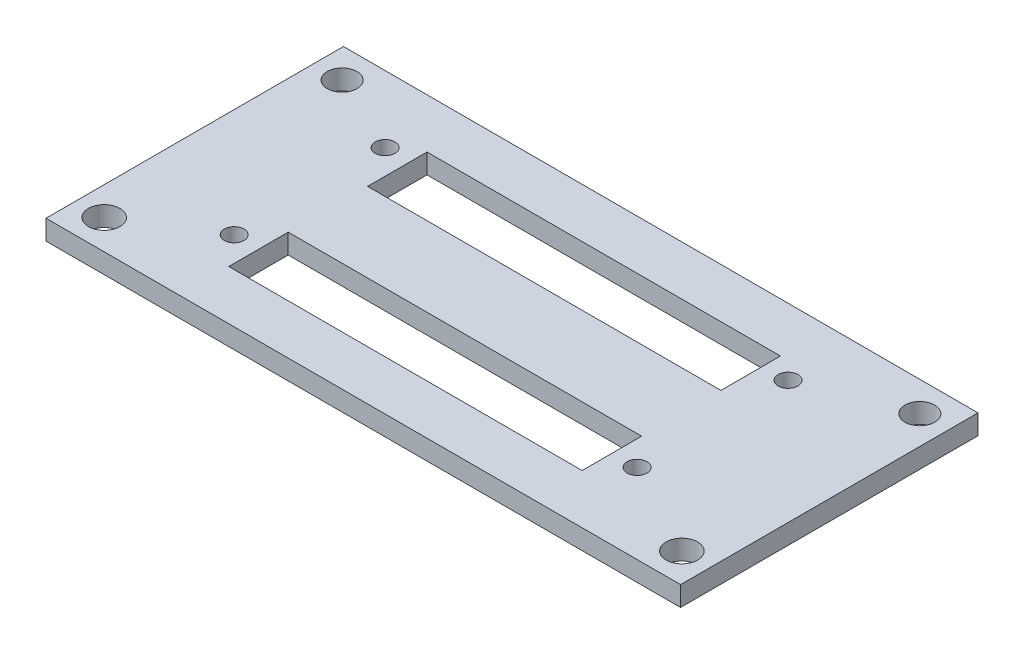
ISO-10303-21;
HEADER;
FILE_DESCRIPTION(('STEP AP214'),'2;1');
FILE_NAME('part.step','',(''),(''),'','','');
FILE_SCHEMA(('AUTOMOTIVE_DESIGN { 1 0 10303 214 1 1 1 1 }'));
ENDSEC;
DATA;
#1=APPLICATION_CONTEXT('core data for automotive mechanical design processes');
#2=APPLICATION_PROTOCOL_DEFINITION('international standard','automotive_design',2000,#1);
#3=PRODUCT_CONTEXT('',#1,'mechanical');
#4=PRODUCT('Part','Part','',(#3));
#5=PRODUCT_RELATED_PRODUCT_CATEGORY('part','',(#4));
#6=PRODUCT_DEFINITION_FORMATION('','',#4);
#7=PRODUCT_DEFINITION_CONTEXT('part definition',#1,'design');
#8=PRODUCT_DEFINITION('design','',#6,#7);
#9=PRODUCT_DEFINITION_SHAPE('','',#8);
#10=(LENGTH_UNIT() NAMED_UNIT(*) SI_UNIT(.MILLI.,.METRE.));
#11=(NAMED_UNIT(*) PLANE_ANGLE_UNIT() SI_UNIT($,.RADIAN.));
#12=(NAMED_UNIT(*) SI_UNIT($,.STERADIAN.) SOLID_ANGLE_UNIT());
#13=UNCERTAINTY_MEASURE_WITH_UNIT(LENGTH_MEASURE(1.E-05),#10,'distance_accuracy_value','');
#14=(GEOMETRIC_REPRESENTATION_CONTEXT(3) GLOBAL_UNCERTAINTY_ASSIGNED_CONTEXT((#13)) GLOBAL_UNIT_ASSIGNED_CONTEXT((#10,
#11,#12)) REPRESENTATION_CONTEXT('',''));
#15=CARTESIAN_POINT('',(0.,0.,0.));
#16=DIRECTION('',(0.,0.,1.));
#17=DIRECTION('',(1.,0.,0.));
#18=AXIS2_PLACEMENT_3D('',#15,#16,#17);
#19=CARTESIAN_POINT('',(0.,2.,0.));
#20=DIRECTION('',(0.,1.,0.));
#21=DIRECTION('',(0.,0.,1.));
#22=AXIS2_PLACEMENT_3D('',#19,#20,#21);
#23=PLANE('',#22);
#24=CARTESIAN_POINT('',(19.5714490056159,2.,-8.26717041311153));
#25=DIRECTION('',(0.,1.,0.));
#26=DIRECTION('',(0.,0.,-1.));
#27=AXIS2_PLACEMENT_3D('',#24,#25,#26);
#28=CIRCLE('',#27,1.);
#29=CARTESIAN_POINT('',(19.5714490056159,2.,-9.26717041311153));
#30=VERTEX_POINT('',#29);
#31=EDGE_CURVE('E185',#30,#30,#28,.T.);
#32=ORIENTED_EDGE('',*,*,#31,.F.);
#33=EDGE_LOOP('',(#32));
#34=FACE_BOUND('',#33,.T.);
#35=CARTESIAN_POINT('',(19.5714490056159,2.,6.95282958688847));
#36=DIRECTION('',(0.,1.,0.));
#37=DIRECTION('',(0.,0.,1.));
#38=AXIS2_PLACEMENT_3D('',#35,#36,#37);
#39=CIRCLE('',#38,1.);
#40=CARTESIAN_POINT('',(19.5714490056159,2.,7.95282958688847));
#41=VERTEX_POINT('',#40);
#42=EDGE_CURVE('E193',#41,#41,#39,.T.);
#43=ORIENTED_EDGE('',*,*,#42,.F.);
#44=EDGE_LOOP('',(#43));
#45=FACE_BOUND('',#44,.T.);
#46=CARTESIAN_POINT('',(-21.0685509943841,2.,6.95282958688847));
#47=DIRECTION('',(0.,1.,0.));
#48=DIRECTION('',(0.,0.,-1.));
#49=AXIS2_PLACEMENT_3D('',#46,#47,#48);
#50=CIRCLE('',#49,1.);
#51=CARTESIAN_POINT('',(-21.0685509943841,2.,5.95282958688847));
#52=VERTEX_POINT('',#51);
#53=EDGE_CURVE('E201',#52,#52,#50,.T.);
#54=ORIENTED_EDGE('',*,*,#53,.F.);
#55=EDGE_LOOP('',(#54));
#56=FACE_BOUND('',#55,.T.);
#57=DIRECTION('',(0.,0.,1.));
#58=VECTOR('',#57,1.);
#59=CARTESIAN_POINT('',(-18.5685509943841,2.,4.00000000000002));
#60=LINE('',#59,#58);
#61=CARTESIAN_POINT('',(-18.5685509943841,2.,4.00000000000002));
#62=VERTEX_POINT('',#61);
#63=CARTESIAN_POINT('',(-18.5685509943841,2.,10.));
#64=VERTEX_POINT('',#63);
#65=EDGE_CURVE('E55',#62,#64,#60,.T.);
#66=ORIENTED_EDGE('',*,*,#65,.F.);
#67=DIRECTION('',(-1.,0.,0.));
#68=VECTOR('',#67,1.);
#69=CARTESIAN_POINT('',(17.0718940548043,2.,4.));
#70=LINE('',#69,#68);
#71=CARTESIAN_POINT('',(17.0718940548043,2.,4.));
#72=VERTEX_POINT('',#71);
#73=EDGE_CURVE('E211',#72,#62,#70,.T.);
#74=ORIENTED_EDGE('',*,*,#73,.F.);
#75=DIRECTION('',(0.,0.,-1.));
#76=VECTOR('',#75,1.);
#77=CARTESIAN_POINT('',(17.0718940548043,2.,4.));
#78=LINE('',#77,#76);
#79=CARTESIAN_POINT('',(17.0718940548043,2.,10.));
#80=VERTEX_POINT('',#79);
#81=EDGE_CURVE('E230',#80,#72,#78,.T.);
#82=ORIENTED_EDGE('',*,*,#81,.F.);
#83=DIRECTION('',(1.,0.,0.));
#84=VECTOR('',#83,1.);
#85=CARTESIAN_POINT('',(17.0718940548043,2.,10.));
#86=LINE('',#85,#84);
#87=EDGE_CURVE('E226',#64,#80,#86,.T.);
#88=ORIENTED_EDGE('',*,*,#87,.F.);
#89=EDGE_LOOP('',(#66,#74,#82,#88));
#90=FACE_BOUND('',#89,.T.);
#91=DIRECTION('',(1.,0.,0.));
#92=VECTOR('',#91,1.);
#93=CARTESIAN_POINT('',(17.0718940548043,2.,-4.));
#94=LINE('',#93,#92);
#95=CARTESIAN_POINT('',(-18.5685509943841,2.,-4.00000000000001));
#96=VERTEX_POINT('',#95);
#97=CARTESIAN_POINT('',(17.0718940548043,2.,-4.));
#98=VERTEX_POINT('',#97);
#99=EDGE_CURVE('E63',#96,#98,#94,.T.);
#100=ORIENTED_EDGE('',*,*,#99,.F.);
#101=DIRECTION('',(0.,0.,1.));
#102=VECTOR('',#101,1.);
#103=CARTESIAN_POINT('',(-18.5685509943841,2.,-4.00000000000001));
#104=LINE('',#103,#102);
#105=CARTESIAN_POINT('',(-18.5685509943841,2.,-9.99999999999999));
#106=VERTEX_POINT('',#105);
#107=EDGE_CURVE('E153',#106,#96,#104,.T.);
#108=ORIENTED_EDGE('',*,*,#107,.F.);
#109=DIRECTION('',(-1.,0.,0.));
#110=VECTOR('',#109,1.);
#111=CARTESIAN_POINT('',(17.0718940548043,2.,-10.));
#112=LINE('',#111,#110);
#113=CARTESIAN_POINT('',(17.0718940548043,2.,-10.));
#114=VERTEX_POINT('',#113);
#115=EDGE_CURVE('E157',#114,#106,#112,.T.);
#116=ORIENTED_EDGE('',*,*,#115,.F.);
#117=DIRECTION('',(0.,0.,-1.));
#118=VECTOR('',#117,1.);
#119=CARTESIAN_POINT('',(17.0718940548043,2.,-4.));
#120=LINE('',#119,#118);
#121=EDGE_CURVE('E166',#98,#114,#120,.T.);
#122=ORIENTED_EDGE('',*,*,#121,.F.);
#123=EDGE_LOOP('',(#100,#108,#116,#122));
#124=FACE_BOUND('',#123,.T.);
#125=CARTESIAN_POINT('',(-21.0685509943841,2.,-8.26717041311153));
#126=DIRECTION('',(0.,1.,0.));
#127=DIRECTION('',(0.,0.,1.));
#128=AXIS2_PLACEMENT_3D('',#125,#126,#127);
#129=CIRCLE('',#128,1.);
#130=CARTESIAN_POINT('',(-21.0685509943841,2.,-7.26717041311153));
#131=VERTEX_POINT('',#130);
#132=EDGE_CURVE('E184',#131,#131,#129,.T.);
#133=ORIENTED_EDGE('',*,*,#132,.F.);
#134=EDGE_LOOP('',(#133));
#135=FACE_BOUND('',#134,.T.);
#136=CARTESIAN_POINT('',(29.13,2.,12.));
#137=DIRECTION('',(0.,1.,0.));
#138=DIRECTION('',(0.,0.,-1.));
#139=AXIS2_PLACEMENT_3D('',#136,#137,#138);
#140=CIRCLE('',#139,1.5893047834575);
#141=CARTESIAN_POINT('',(29.13,2.,10.4106952165425));
#142=VERTEX_POINT('',#141);
#143=EDGE_CURVE('E263',#142,#142,#140,.T.);
#144=ORIENTED_EDGE('',*,*,#143,.F.);
#145=EDGE_LOOP('',(#144));
#146=FACE_BOUND('',#145,.T.);
#147=CARTESIAN_POINT('',(-29.13,2.,12.));
#148=DIRECTION('',(0.,1.,0.));
#149=DIRECTION('',(0.,0.,1.));
#150=AXIS2_PLACEMENT_3D('',#147,#148,#149);
#151=CIRCLE('',#150,1.5893047834575);
#152=CARTESIAN_POINT('',(-29.13,2.,13.5893047834575));
#153=VERTEX_POINT('',#152);
#154=EDGE_CURVE('E279',#153,#153,#151,.T.);
#155=ORIENTED_EDGE('',*,*,#154,.F.);
#156=EDGE_LOOP('',(#155));
#157=FACE_BOUND('',#156,.T.);
#158=DIRECTION('',(0.,0.,1.));
#159=VECTOR('',#158,1.);
#160=CARTESIAN_POINT('',(-32.,2.,15.));
#161=LINE('',#160,#159);
#162=CARTESIAN_POINT('',(-32.,2.,-15.));
#163=VERTEX_POINT('',#162);
#164=CARTESIAN_POINT('',(-32.,2.,15.));
#165=VERTEX_POINT('',#164);
#166=EDGE_CURVE('E287',#163,#165,#161,.T.);
#167=ORIENTED_EDGE('',*,*,#166,.T.);
#168=DIRECTION('',(1.,0.,0.));
#169=VECTOR('',#168,1.);
#170=CARTESIAN_POINT('',(32.,2.,15.));
#171=LINE('',#170,#169);
#172=CARTESIAN_POINT('',(32.,2.,15.));
#173=VERTEX_POINT('',#172);
#174=EDGE_CURVE('E291',#165,#173,#171,.T.);
#175=ORIENTED_EDGE('',*,*,#174,.T.);
#176=DIRECTION('',(0.,0.,-1.));
#177=VECTOR('',#176,1.);
#178=CARTESIAN_POINT('',(32.,2.,15.));
#179=LINE('',#178,#177);
#180=CARTESIAN_POINT('',(32.,2.,-15.));
#181=VERTEX_POINT('',#180);
#182=EDGE_CURVE('E295',#173,#181,#179,.T.);
#183=ORIENTED_EDGE('',*,*,#182,.T.);
#184=DIRECTION('',(-1.,0.,0.));
#185=VECTOR('',#184,1.);
#186=CARTESIAN_POINT('',(32.,2.,-15.));
#187=LINE('',#186,#185);
#188=EDGE_CURVE('E298',#181,#163,#187,.T.);
#189=ORIENTED_EDGE('',*,*,#188,.T.);
#190=EDGE_LOOP('',(#167,#175,#183,#189));
#191=FACE_BOUND('',#190,.T.);
#192=CARTESIAN_POINT('',(-29.1341194094145,2.,-12.));
#193=DIRECTION('',(0.,1.,0.));
#194=DIRECTION('',(0.,0.,1.));
#195=AXIS2_PLACEMENT_3D('',#192,#193,#194);
#196=CIRCLE('',#195,1.5);
#197=CARTESIAN_POINT('',(-29.1341194094145,2.,-10.5));
#198=VERTEX_POINT('',#197);
#199=EDGE_CURVE('E271',#198,#198,#196,.T.);
#200=ORIENTED_EDGE('',*,*,#199,.F.);
#201=EDGE_LOOP('',(#200));
#202=FACE_BOUND('',#201,.T.);
#203=CARTESIAN_POINT('',(29.1341194094144,2.,-12.));
#204=DIRECTION('',(0.,1.,0.));
#205=DIRECTION('',(0.,0.,-1.));
#206=AXIS2_PLACEMENT_3D('',#203,#204,#205);
#207=CIRCLE('',#206,1.5);
#208=CARTESIAN_POINT('',(29.1341194094144,2.,-13.5));
#209=VERTEX_POINT('',#208);
#210=EDGE_CURVE('E255',#209,#209,#207,.T.);
#211=ORIENTED_EDGE('',*,*,#210,.F.);
#212=EDGE_LOOP('',(#211));
#213=FACE_BOUND('',#212,.T.);
#214=ADVANCED_FACE('F39',(#34,#45,#56,#90,#124,#135,#146,#157,#191,#202,#213),#23,.T.);
#215=CARTESIAN_POINT('',(0.,0.,0.));
#216=DIRECTION('',(0.,1.,0.));
#217=DIRECTION('',(0.,0.,1.));
#218=AXIS2_PLACEMENT_3D('',#215,#216,#217);
#219=PLANE('',#218);
#220=CARTESIAN_POINT('',(19.5714490056159,0.,-8.26717041311153));
#221=DIRECTION('',(0.,1.,0.));
#222=DIRECTION('',(0.,0.,-1.));
#223=AXIS2_PLACEMENT_3D('',#220,#221,#222);
#224=CIRCLE('',#223,1.);
#225=CARTESIAN_POINT('',(19.5714490056159,0.,-9.26717041311153));
#226=VERTEX_POINT('',#225);
#227=EDGE_CURVE('E180',#226,#226,#224,.T.);
#228=ORIENTED_EDGE('',*,*,#227,.T.);
#229=EDGE_LOOP('',(#228));
#230=FACE_BOUND('',#229,.T.);
#231=CARTESIAN_POINT('',(19.5714490056159,0.,6.95282958688847));
#232=DIRECTION('',(0.,1.,0.));
#233=DIRECTION('',(0.,0.,1.));
#234=AXIS2_PLACEMENT_3D('',#231,#232,#233);
#235=CIRCLE('',#234,1.);
#236=CARTESIAN_POINT('',(19.5714490056159,0.,7.95282958688847));
#237=VERTEX_POINT('',#236);
#238=EDGE_CURVE('E189',#237,#237,#235,.T.);
#239=ORIENTED_EDGE('',*,*,#238,.T.);
#240=EDGE_LOOP('',(#239));
#241=FACE_BOUND('',#240,.T.);
#242=CARTESIAN_POINT('',(-21.0685509943841,0.,6.95282958688847));
#243=DIRECTION('',(0.,1.,0.));
#244=DIRECTION('',(0.,0.,-1.));
#245=AXIS2_PLACEMENT_3D('',#242,#243,#244);
#246=CIRCLE('',#245,1.);
#247=CARTESIAN_POINT('',(-21.0685509943841,0.,5.95282958688847));
#248=VERTEX_POINT('',#247);
#249=EDGE_CURVE('E197',#248,#248,#246,.T.);
#250=ORIENTED_EDGE('',*,*,#249,.T.);
#251=EDGE_LOOP('',(#250));
#252=FACE_BOUND('',#251,.T.);
#253=DIRECTION('',(-1.,0.,0.));
#254=VECTOR('',#253,1.);
#255=CARTESIAN_POINT('',(17.0718940548043,0.,4.));
#256=LINE('',#255,#254);
#257=CARTESIAN_POINT('',(17.0718940548043,0.,4.));
#258=VERTEX_POINT('',#257);
#259=CARTESIAN_POINT('',(-18.5685509943841,0.,4.00000000000002));
#260=VERTEX_POINT('',#259);
#261=EDGE_CURVE('E219',#258,#260,#256,.T.);
#262=ORIENTED_EDGE('',*,*,#261,.T.);
#263=DIRECTION('',(0.,0.,1.));
#264=VECTOR('',#263,1.);
#265=CARTESIAN_POINT('',(-18.5685509943841,0.,4.00000000000002));
#266=LINE('',#265,#264);
#267=CARTESIAN_POINT('',(-18.5685509943841,0.,10.));
#268=VERTEX_POINT('',#267);
#269=EDGE_CURVE('E206',#260,#268,#266,.T.);
#270=ORIENTED_EDGE('',*,*,#269,.T.);
#271=DIRECTION('',(1.,0.,0.));
#272=VECTOR('',#271,1.);
#273=CARTESIAN_POINT('',(17.0718940548043,0.,10.));
#274=LINE('',#273,#272);
#275=CARTESIAN_POINT('',(17.0718940548043,0.,10.));
#276=VERTEX_POINT('',#275);
#277=EDGE_CURVE('E210',#268,#276,#274,.T.);
#278=ORIENTED_EDGE('',*,*,#277,.T.);
#279=DIRECTION('',(0.,0.,-1.));
#280=VECTOR('',#279,1.);
#281=CARTESIAN_POINT('',(17.0718940548043,0.,4.));
#282=LINE('',#281,#280);
#283=EDGE_CURVE('E215',#276,#258,#282,.T.);
#284=ORIENTED_EDGE('',*,*,#283,.T.);
#285=EDGE_LOOP('',(#262,#270,#278,#284));
#286=FACE_BOUND('',#285,.T.);
#287=DIRECTION('',(0.,0.,1.));
#288=VECTOR('',#287,1.);
#289=CARTESIAN_POINT('',(-18.5685509943841,0.,-4.00000000000001));
#290=LINE('',#289,#288);
#291=CARTESIAN_POINT('',(-18.5685509943841,0.,-9.99999999999999));
#292=VERTEX_POINT('',#291);
#293=CARTESIAN_POINT('',(-18.5685509943841,0.,-4.00000000000001));
#294=VERTEX_POINT('',#293);
#295=EDGE_CURVE('E138',#292,#294,#290,.T.);
#296=ORIENTED_EDGE('',*,*,#295,.T.);
#297=DIRECTION('',(1.,0.,0.));
#298=VECTOR('',#297,1.);
#299=CARTESIAN_POINT('',(17.0718940548043,0.,-4.));
#300=LINE('',#299,#298);
#301=CARTESIAN_POINT('',(17.0718940548043,0.,-4.));
#302=VERTEX_POINT('',#301);
#303=EDGE_CURVE('E131',#294,#302,#300,.T.);
#304=ORIENTED_EDGE('',*,*,#303,.T.);
#305=DIRECTION('',(0.,0.,-1.));
#306=VECTOR('',#305,1.);
#307=CARTESIAN_POINT('',(17.0718940548043,0.,-4.));
#308=LINE('',#307,#306);
#309=CARTESIAN_POINT('',(17.0718940548043,0.,-10.));
#310=VERTEX_POINT('',#309);
#311=EDGE_CURVE('E142',#302,#310,#308,.T.);
#312=ORIENTED_EDGE('',*,*,#311,.T.);
#313=DIRECTION('',(-1.,0.,0.));
#314=VECTOR('',#313,1.);
#315=CARTESIAN_POINT('',(17.0718940548043,0.,-10.));
#316=LINE('',#315,#314);
#317=EDGE_CURVE('E147',#310,#292,#316,.T.);
#318=ORIENTED_EDGE('',*,*,#317,.T.);
#319=EDGE_LOOP('',(#296,#304,#312,#318));
#320=FACE_BOUND('',#319,.T.);
#321=CARTESIAN_POINT('',(-21.0685509943841,0.,-8.26717041311153));
#322=DIRECTION('',(0.,1.,0.));
#323=DIRECTION('',(0.,0.,1.));
#324=AXIS2_PLACEMENT_3D('',#321,#322,#323);
#325=CIRCLE('',#324,1.);
#326=CARTESIAN_POINT('',(-21.0685509943841,0.,-7.26717041311153));
#327=VERTEX_POINT('',#326);
#328=EDGE_CURVE('E247',#327,#327,#325,.T.);
#329=ORIENTED_EDGE('',*,*,#328,.T.);
#330=EDGE_LOOP('',(#329));
#331=FACE_BOUND('',#330,.T.);
#332=DIRECTION('',(0.,0.,1.));
#333=VECTOR('',#332,1.);
#334=CARTESIAN_POINT('',(-32.,0.,15.));
#335=LINE('',#334,#333);
#336=CARTESIAN_POINT('',(-32.,0.,-15.));
#337=VERTEX_POINT('',#336);
#338=CARTESIAN_POINT('',(-32.,0.,15.));
#339=VERTEX_POINT('',#338);
#340=EDGE_CURVE('E283',#337,#339,#335,.T.);
#341=ORIENTED_EDGE('',*,*,#340,.F.);
#342=DIRECTION('',(-1.,0.,0.));
#343=VECTOR('',#342,1.);
#344=CARTESIAN_POINT('',(32.,0.,-15.));
#345=LINE('',#344,#343);
#346=CARTESIAN_POINT('',(32.,0.,-15.));
#347=VERTEX_POINT('',#346);
#348=EDGE_CURVE('E292',#347,#337,#345,.T.);
#349=ORIENTED_EDGE('',*,*,#348,.F.);
#350=DIRECTION('',(0.,0.,-1.));
#351=VECTOR('',#350,1.);
#352=CARTESIAN_POINT('',(32.,0.,15.));
#353=LINE('',#352,#351);
#354=CARTESIAN_POINT('',(32.,0.,15.));
#355=VERTEX_POINT('',#354);
#356=EDGE_CURVE('E308',#355,#347,#353,.T.);
#357=ORIENTED_EDGE('',*,*,#356,.F.);
#358=DIRECTION('',(1.,0.,0.));
#359=VECTOR('',#358,1.);
#360=CARTESIAN_POINT('',(32.,0.,15.));
#361=LINE('',#360,#359);
#362=EDGE_CURVE('E305',#339,#355,#361,.T.);
#363=ORIENTED_EDGE('',*,*,#362,.F.);
#364=EDGE_LOOP('',(#341,#349,#357,#363));
#365=FACE_BOUND('',#364,.T.);
#366=CARTESIAN_POINT('',(-29.13,0.,12.));
#367=DIRECTION('',(0.,1.,0.));
#368=DIRECTION('',(0.,0.,1.));
#369=AXIS2_PLACEMENT_3D('',#366,#367,#368);
#370=CIRCLE('',#369,1.5893047834575);
#371=CARTESIAN_POINT('',(-29.13,0.,13.5893047834575));
#372=VERTEX_POINT('',#371);
#373=EDGE_CURVE('E275',#372,#372,#370,.T.);
#374=ORIENTED_EDGE('',*,*,#373,.T.);
#375=EDGE_LOOP('',(#374));
#376=FACE_BOUND('',#375,.T.);
#377=CARTESIAN_POINT('',(-29.1341194094145,0.,-12.));
#378=DIRECTION('',(0.,1.,0.));
#379=DIRECTION('',(0.,0.,1.));
#380=AXIS2_PLACEMENT_3D('',#377,#378,#379);
#381=CIRCLE('',#380,1.5);
#382=CARTESIAN_POINT('',(-29.1341194094145,0.,-10.5));
#383=VERTEX_POINT('',#382);
#384=EDGE_CURVE('E267',#383,#383,#381,.T.);
#385=ORIENTED_EDGE('',*,*,#384,.T.);
#386=EDGE_LOOP('',(#385));
#387=FACE_BOUND('',#386,.T.);
#388=CARTESIAN_POINT('',(29.13,0.,12.));
#389=DIRECTION('',(0.,1.,0.));
#390=DIRECTION('',(0.,0.,-1.));
#391=AXIS2_PLACEMENT_3D('',#388,#389,#390);
#392=CIRCLE('',#391,1.5893047834575);
#393=CARTESIAN_POINT('',(29.13,0.,10.4106952165425));
#394=VERTEX_POINT('',#393);
#395=EDGE_CURVE('E259',#394,#394,#392,.T.);
#396=ORIENTED_EDGE('',*,*,#395,.T.);
#397=EDGE_LOOP('',(#396));
#398=FACE_BOUND('',#397,.T.);
#399=CARTESIAN_POINT('',(29.1341194094144,0.,-12.));
#400=DIRECTION('',(0.,1.,0.));
#401=DIRECTION('',(0.,0.,-1.));
#402=AXIS2_PLACEMENT_3D('',#399,#400,#401);
#403=CIRCLE('',#402,1.5);
#404=CARTESIAN_POINT('',(29.1341194094144,0.,-13.5));
#405=VERTEX_POINT('',#404);
#406=EDGE_CURVE('E251',#405,#405,#403,.T.);
#407=ORIENTED_EDGE('',*,*,#406,.T.);
#408=EDGE_LOOP('',(#407));
#409=FACE_BOUND('',#408,.T.);
#410=ADVANCED_FACE('F149',(#230,#241,#252,#286,#320,#331,#365,#376,#387,#398,#409),#219,.F.);
#411=CARTESIAN_POINT('',(-32.,2.,15.));
#412=DIRECTION('',(1.,0.,0.));
#413=DIRECTION('',(0.,0.,-1.));
#414=AXIS2_PLACEMENT_3D('',#411,#412,#413);
#415=PLANE('',#414);
#416=ORIENTED_EDGE('',*,*,#340,.T.);
#417=DIRECTION('',(0.,-1.,0.));
#418=VECTOR('',#417,1.);
#419=CARTESIAN_POINT('',(-32.,2.,15.));
#420=LINE('',#419,#418);
#421=EDGE_CURVE('E11',#165,#339,#420,.T.);
#422=ORIENTED_EDGE('',*,*,#421,.F.);
#423=ORIENTED_EDGE('',*,*,#166,.F.);
#424=DIRECTION('',(0.,-1.,0.));
#425=VECTOR('',#424,1.);
#426=CARTESIAN_POINT('',(-32.,2.,-15.));
#427=LINE('',#426,#425);
#428=EDGE_CURVE('E301',#163,#337,#427,.T.);
#429=ORIENTED_EDGE('',*,*,#428,.T.);
#430=EDGE_LOOP('',(#416,#422,#423,#429));
#431=FACE_BOUND('',#430,.T.);
#432=ADVANCED_FACE('F41',(#431),#415,.F.);
#433=CARTESIAN_POINT('',(32.,2.,15.));
#434=DIRECTION('',(0.,0.,-1.));
#435=DIRECTION('',(-1.,0.,0.));
#436=AXIS2_PLACEMENT_3D('',#433,#434,#435);
#437=PLANE('',#436);
#438=ORIENTED_EDGE('',*,*,#362,.T.);
#439=DIRECTION('',(0.,-1.,0.));
#440=VECTOR('',#439,1.);
#441=CARTESIAN_POINT('',(32.,2.,15.));
#442=LINE('',#441,#440);
#443=EDGE_CURVE('E48',#173,#355,#442,.T.);
#444=ORIENTED_EDGE('',*,*,#443,.F.);
#445=ORIENTED_EDGE('',*,*,#174,.F.);
#446=ORIENTED_EDGE('',*,*,#421,.T.);
#447=EDGE_LOOP('',(#438,#444,#445,#446));
#448=FACE_BOUND('',#447,.T.);
#449=ADVANCED_FACE('F341',(#448),#437,.F.);
#450=CARTESIAN_POINT('',(32.,2.,15.));
#451=DIRECTION('',(-1.,0.,0.));
#452=DIRECTION('',(0.,0.,1.));
#453=AXIS2_PLACEMENT_3D('',#450,#451,#452);
#454=PLANE('',#453);
#455=ORIENTED_EDGE('',*,*,#356,.T.);
#456=DIRECTION('',(0.,-1.,0.));
#457=VECTOR('',#456,1.);
#458=CARTESIAN_POINT('',(32.,2.,-15.));
#459=LINE('',#458,#457);
#460=EDGE_CURVE('E316',#181,#347,#459,.T.);
#461=ORIENTED_EDGE('',*,*,#460,.F.);
#462=ORIENTED_EDGE('',*,*,#182,.F.);
#463=ORIENTED_EDGE('',*,*,#443,.T.);
#464=EDGE_LOOP('',(#455,#461,#462,#463));
#465=FACE_BOUND('',#464,.T.);
#466=ADVANCED_FACE('F325',(#465),#454,.F.);
#467=CARTESIAN_POINT('',(32.,2.,-15.));
#468=DIRECTION('',(0.,0.,1.));
#469=DIRECTION('',(1.,0.,0.));
#470=AXIS2_PLACEMENT_3D('',#467,#468,#469);
#471=PLANE('',#470);
#472=ORIENTED_EDGE('',*,*,#348,.T.);
#473=ORIENTED_EDGE('',*,*,#428,.F.);
#474=ORIENTED_EDGE('',*,*,#188,.F.);
#475=ORIENTED_EDGE('',*,*,#460,.T.);
#476=EDGE_LOOP('',(#472,#473,#474,#475));
#477=FACE_BOUND('',#476,.T.);
#478=ADVANCED_FACE('F334',(#477),#471,.F.);
#479=CARTESIAN_POINT('',(-29.13,2.,12.));
#480=DIRECTION('',(0.,-1.,0.));
#481=DIRECTION('',(0.,0.,-1.));
#482=AXIS2_PLACEMENT_3D('',#479,#480,#481);
#483=CYLINDRICAL_SURFACE('',#482,1.5893047834575);
#484=ORIENTED_EDGE('',*,*,#154,.T.);
#485=EDGE_LOOP('',(#484));
#486=FACE_BOUND('',#485,.T.);
#487=ORIENTED_EDGE('',*,*,#373,.F.);
#488=EDGE_LOOP('',(#487));
#489=FACE_BOUND('',#488,.T.);
#490=ADVANCED_FACE('F359',(#486,#489),#483,.F.);
#491=CARTESIAN_POINT('',(-29.1341194094145,2.,-12.));
#492=DIRECTION('',(0.,-1.,0.));
#493=DIRECTION('',(0.,0.,-1.));
#494=AXIS2_PLACEMENT_3D('',#491,#492,#493);
#495=CYLINDRICAL_SURFACE('',#494,1.5);
#496=ORIENTED_EDGE('',*,*,#199,.T.);
#497=EDGE_LOOP('',(#496));
#498=FACE_BOUND('',#497,.T.);
#499=ORIENTED_EDGE('',*,*,#384,.F.);
#500=EDGE_LOOP('',(#499));
#501=FACE_BOUND('',#500,.T.);
#502=ADVANCED_FACE('F366',(#498,#501),#495,.F.);
#503=CARTESIAN_POINT('',(29.13,2.,12.));
#504=DIRECTION('',(0.,-1.,0.));
#505=DIRECTION('',(0.,0.,-1.));
#506=AXIS2_PLACEMENT_3D('',#503,#504,#505);
#507=CYLINDRICAL_SURFACE('',#506,1.5893047834575);
#508=ORIENTED_EDGE('',*,*,#143,.T.);
#509=EDGE_LOOP('',(#508));
#510=FACE_BOUND('',#509,.T.);
#511=ORIENTED_EDGE('',*,*,#395,.F.);
#512=EDGE_LOOP('',(#511));
#513=FACE_BOUND('',#512,.T.);
#514=ADVANCED_FACE('F371',(#510,#513),#507,.F.);
#515=CARTESIAN_POINT('',(29.1341194094144,2.,-12.));
#516=DIRECTION('',(0.,-1.,0.));
#517=DIRECTION('',(0.,0.,-1.));
#518=AXIS2_PLACEMENT_3D('',#515,#516,#517);
#519=CYLINDRICAL_SURFACE('',#518,1.5);
#520=ORIENTED_EDGE('',*,*,#210,.T.);
#521=EDGE_LOOP('',(#520));
#522=FACE_BOUND('',#521,.T.);
#523=ORIENTED_EDGE('',*,*,#406,.F.);
#524=EDGE_LOOP('',(#523));
#525=FACE_BOUND('',#524,.T.);
#526=ADVANCED_FACE('F383',(#522,#525),#519,.F.);
#527=CARTESIAN_POINT('',(-21.0685509943841,0.,-8.26717041311153));
#528=DIRECTION('',(0.,1.,0.));
#529=DIRECTION('',(0.,0.,1.));
#530=AXIS2_PLACEMENT_3D('',#527,#528,#529);
#531=CYLINDRICAL_SURFACE('',#530,1.);
#532=ORIENTED_EDGE('',*,*,#328,.F.);
#533=EDGE_LOOP('',(#532));
#534=FACE_BOUND('',#533,.T.);
#535=ORIENTED_EDGE('',*,*,#132,.T.);
#536=EDGE_LOOP('',(#535));
#537=FACE_BOUND('',#536,.T.);
#538=ADVANCED_FACE('F385',(#534,#537),#531,.F.);
#539=CARTESIAN_POINT('',(17.0718940548043,0.,-4.));
#540=DIRECTION('',(0.,0.,1.));
#541=DIRECTION('',(1.,0.,0.));
#542=AXIS2_PLACEMENT_3D('',#539,#540,#541);
#543=PLANE('',#542);
#544=ORIENTED_EDGE('',*,*,#99,.T.);
#545=DIRECTION('',(0.,1.,0.));
#546=VECTOR('',#545,1.);
#547=CARTESIAN_POINT('',(17.0718940548043,0.,-4.));
#548=LINE('',#547,#546);
#549=EDGE_CURVE('E127',#302,#98,#548,.T.);
#550=ORIENTED_EDGE('',*,*,#549,.F.);
#551=ORIENTED_EDGE('',*,*,#303,.F.);
#552=DIRECTION('',(0.,1.,0.));
#553=VECTOR('',#552,1.);
#554=CARTESIAN_POINT('',(-18.5685509943841,0.,-4.00000000000001));
#555=LINE('',#554,#553);
#556=EDGE_CURVE('E172',#294,#96,#555,.T.);
#557=ORIENTED_EDGE('',*,*,#556,.T.);
#558=EDGE_LOOP('',(#544,#550,#551,#557));
#559=FACE_BOUND('',#558,.T.);
#560=ADVANCED_FACE('F129',(#559),#543,.F.);
#561=CARTESIAN_POINT('',(-18.5685509943841,0.,-4.00000000000001));
#562=DIRECTION('',(-1.,0.,0.));
#563=DIRECTION('',(0.,0.,1.));
#564=AXIS2_PLACEMENT_3D('',#561,#562,#563);
#565=PLANE('',#564);
#566=ORIENTED_EDGE('',*,*,#107,.T.);
#567=ORIENTED_EDGE('',*,*,#556,.F.);
#568=ORIENTED_EDGE('',*,*,#295,.F.);
#569=DIRECTION('',(0.,1.,0.));
#570=VECTOR('',#569,1.);
#571=CARTESIAN_POINT('',(-18.5685509943841,0.,-9.99999999999999));
#572=LINE('',#571,#570);
#573=EDGE_CURVE('E175',#292,#106,#572,.T.);
#574=ORIENTED_EDGE('',*,*,#573,.T.);
#575=EDGE_LOOP('',(#566,#567,#568,#574));
#576=FACE_BOUND('',#575,.T.);
#577=ADVANCED_FACE('F426',(#576),#565,.F.);
#578=CARTESIAN_POINT('',(17.0718940548043,0.,-10.));
#579=DIRECTION('',(0.,0.,-1.));
#580=DIRECTION('',(-1.,0.,0.));
#581=AXIS2_PLACEMENT_3D('',#578,#579,#580);
#582=PLANE('',#581);
#583=ORIENTED_EDGE('',*,*,#115,.T.);
#584=ORIENTED_EDGE('',*,*,#573,.F.);
#585=ORIENTED_EDGE('',*,*,#317,.F.);
#586=DIRECTION('',(0.,1.,0.));
#587=VECTOR('',#586,1.);
#588=CARTESIAN_POINT('',(17.0718940548043,0.,-10.));
#589=LINE('',#588,#587);
#590=EDGE_CURVE('E137',#310,#114,#589,.T.);
#591=ORIENTED_EDGE('',*,*,#590,.T.);
#592=EDGE_LOOP('',(#583,#584,#585,#591));
#593=FACE_BOUND('',#592,.T.);
#594=ADVANCED_FACE('F429',(#593),#582,.F.);
#595=CARTESIAN_POINT('',(17.0718940548043,0.,-4.));
#596=DIRECTION('',(1.,0.,0.));
#597=DIRECTION('',(0.,0.,-1.));
#598=AXIS2_PLACEMENT_3D('',#595,#596,#597);
#599=PLANE('',#598);
#600=ORIENTED_EDGE('',*,*,#121,.T.);
#601=ORIENTED_EDGE('',*,*,#590,.F.);
#602=ORIENTED_EDGE('',*,*,#311,.F.);
#603=ORIENTED_EDGE('',*,*,#549,.T.);
#604=EDGE_LOOP('',(#600,#601,#602,#603));
#605=FACE_BOUND('',#604,.T.);
#606=ADVANCED_FACE('F143',(#605),#599,.F.);
#607=CARTESIAN_POINT('',(-18.5685509943841,0.,4.00000000000002));
#608=DIRECTION('',(-1.,0.,0.));
#609=DIRECTION('',(0.,0.,1.));
#610=AXIS2_PLACEMENT_3D('',#607,#608,#609);
#611=PLANE('',#610);
#612=ORIENTED_EDGE('',*,*,#65,.T.);
#613=DIRECTION('',(0.,1.,0.));
#614=VECTOR('',#613,1.);
#615=CARTESIAN_POINT('',(-18.5685509943841,0.,10.));
#616=LINE('',#615,#614);
#617=EDGE_CURVE('E223',#268,#64,#616,.T.);
#618=ORIENTED_EDGE('',*,*,#617,.F.);
#619=ORIENTED_EDGE('',*,*,#269,.F.);
#620=DIRECTION('',(0.,1.,0.));
#621=VECTOR('',#620,1.);
#622=CARTESIAN_POINT('',(-18.5685509943841,0.,4.00000000000002));
#623=LINE('',#622,#621);
#624=EDGE_CURVE('E205',#260,#62,#623,.T.);
#625=ORIENTED_EDGE('',*,*,#624,.T.);
#626=EDGE_LOOP('',(#612,#618,#619,#625));
#627=FACE_BOUND('',#626,.T.);
#628=ADVANCED_FACE('F397',(#627),#611,.F.);
#629=CARTESIAN_POINT('',(17.0718940548043,0.,4.));
#630=DIRECTION('',(0.,0.,-1.));
#631=DIRECTION('',(-1.,0.,0.));
#632=AXIS2_PLACEMENT_3D('',#629,#630,#631);
#633=PLANE('',#632);
#634=ORIENTED_EDGE('',*,*,#73,.T.);
#635=ORIENTED_EDGE('',*,*,#624,.F.);
#636=ORIENTED_EDGE('',*,*,#261,.F.);
#637=DIRECTION('',(0.,1.,0.));
#638=VECTOR('',#637,1.);
#639=CARTESIAN_POINT('',(17.0718940548043,0.,4.));
#640=LINE('',#639,#638);
#641=EDGE_CURVE('E239',#258,#72,#640,.T.);
#642=ORIENTED_EDGE('',*,*,#641,.T.);
#643=EDGE_LOOP('',(#634,#635,#636,#642));
#644=FACE_BOUND('',#643,.T.);
#645=ADVANCED_FACE('F400',(#644),#633,.F.);
#646=CARTESIAN_POINT('',(17.0718940548043,0.,4.));
#647=DIRECTION('',(1.,0.,0.));
#648=DIRECTION('',(0.,0.,-1.));
#649=AXIS2_PLACEMENT_3D('',#646,#647,#648);
#650=PLANE('',#649);
#651=ORIENTED_EDGE('',*,*,#81,.T.);
#652=ORIENTED_EDGE('',*,*,#641,.F.);
#653=ORIENTED_EDGE('',*,*,#283,.F.);
#654=DIRECTION('',(0.,1.,0.));
#655=VECTOR('',#654,1.);
#656=CARTESIAN_POINT('',(17.0718940548043,0.,10.));
#657=LINE('',#656,#655);
#658=EDGE_CURVE('E242',#276,#80,#657,.T.);
#659=ORIENTED_EDGE('',*,*,#658,.T.);
#660=EDGE_LOOP('',(#651,#652,#653,#659));
#661=FACE_BOUND('',#660,.T.);
#662=ADVANCED_FACE('F405',(#661),#650,.F.);
#663=CARTESIAN_POINT('',(17.0718940548043,0.,10.));
#664=DIRECTION('',(0.,0.,1.));
#665=DIRECTION('',(1.,0.,0.));
#666=AXIS2_PLACEMENT_3D('',#663,#664,#665);
#667=PLANE('',#666);
#668=ORIENTED_EDGE('',*,*,#87,.T.);
#669=ORIENTED_EDGE('',*,*,#658,.F.);
#670=ORIENTED_EDGE('',*,*,#277,.F.);
#671=ORIENTED_EDGE('',*,*,#617,.T.);
#672=EDGE_LOOP('',(#668,#669,#670,#671));
#673=FACE_BOUND('',#672,.T.);
#674=ADVANCED_FACE('F401',(#673),#667,.F.);
#675=CARTESIAN_POINT('',(-21.0685509943841,0.,6.95282958688847));
#676=DIRECTION('',(0.,1.,0.));
#677=DIRECTION('',(0.,0.,1.));
#678=AXIS2_PLACEMENT_3D('',#675,#676,#677);
#679=CYLINDRICAL_SURFACE('',#678,1.);
#680=ORIENTED_EDGE('',*,*,#249,.F.);
#681=EDGE_LOOP('',(#680));
#682=FACE_BOUND('',#681,.T.);
#683=ORIENTED_EDGE('',*,*,#53,.T.);
#684=EDGE_LOOP('',(#683));
#685=FACE_BOUND('',#684,.T.);
#686=ADVANCED_FACE('F404',(#682,#685),#679,.F.);
#687=CARTESIAN_POINT('',(19.5714490056159,0.,6.95282958688847));
#688=DIRECTION('',(0.,1.,0.));
#689=DIRECTION('',(0.,0.,1.));
#690=AXIS2_PLACEMENT_3D('',#687,#688,#689);
#691=CYLINDRICAL_SURFACE('',#690,1.);
#692=ORIENTED_EDGE('',*,*,#238,.F.);
#693=EDGE_LOOP('',(#692));
#694=FACE_BOUND('',#693,.T.);
#695=ORIENTED_EDGE('',*,*,#42,.T.);
#696=EDGE_LOOP('',(#695));
#697=FACE_BOUND('',#696,.T.);
#698=ADVANCED_FACE('F415',(#694,#697),#691,.F.);
#699=CARTESIAN_POINT('',(19.5714490056159,0.,-8.26717041311153));
#700=DIRECTION('',(0.,1.,0.));
#701=DIRECTION('',(0.,0.,1.));
#702=AXIS2_PLACEMENT_3D('',#699,#700,#701);
#703=CYLINDRICAL_SURFACE('',#702,1.);
#704=ORIENTED_EDGE('',*,*,#227,.F.);
#705=EDGE_LOOP('',(#704));
#706=FACE_BOUND('',#705,.T.);
#707=ORIENTED_EDGE('',*,*,#31,.T.);
#708=EDGE_LOOP('',(#707));
#709=FACE_BOUND('',#708,.T.);
#710=ADVANCED_FACE('F419',(#706,#709),#703,.F.);
#711=CLOSED_SHELL('',(#214,#410,#432,#449,#466,#478,#490,#502,#514,#526,#538,#560,#577,#594,
#606,#628,#645,#662,#674,#686,#698,#710));
#712=MANIFOLD_SOLID_BREP('B2',#711);
#713=ADVANCED_BREP_SHAPE_REPRESENTATION('',(#18,#712),#14);
#714=SHAPE_DEFINITION_REPRESENTATION(#9,#713);
ENDSEC;
END-ISO-10303-21;
